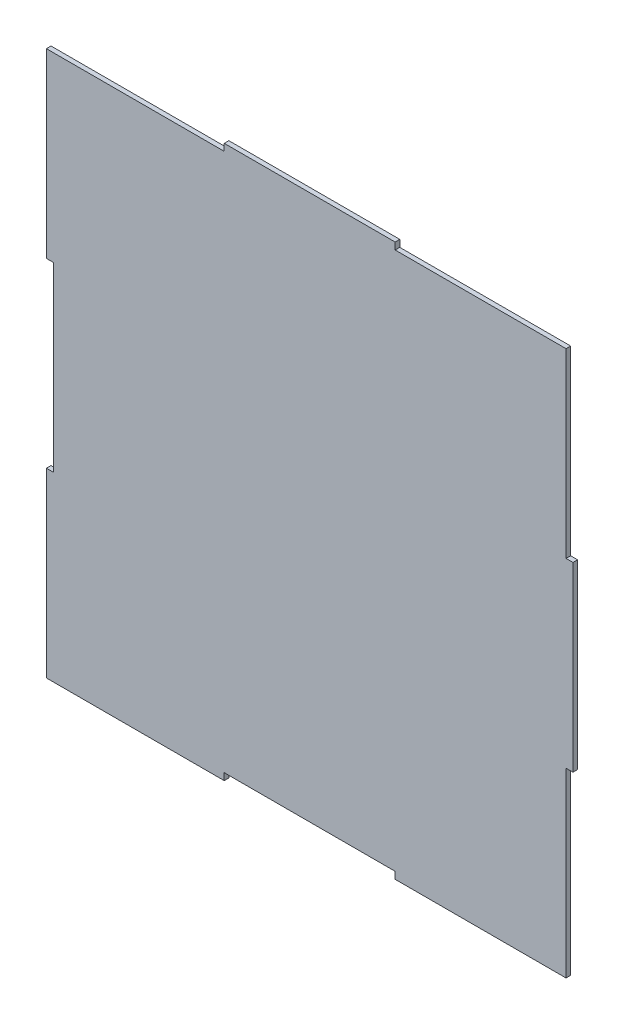
ISO-10303-21;
HEADER;
FILE_DESCRIPTION(('STEP AP214'),'2;1');
FILE_NAME('part.step','',(''),(''),'','','');
FILE_SCHEMA(('AUTOMOTIVE_DESIGN { 1 0 10303 214 1 1 1 1 }'));
ENDSEC;
DATA;
#1=APPLICATION_CONTEXT('core data for automotive mechanical design processes');
#2=APPLICATION_PROTOCOL_DEFINITION('international standard','automotive_design',2000,#1);
#3=PRODUCT_CONTEXT('',#1,'mechanical');
#4=PRODUCT('Part','Part','',(#3));
#5=PRODUCT_RELATED_PRODUCT_CATEGORY('part','',(#4));
#6=PRODUCT_DEFINITION_FORMATION('','',#4);
#7=PRODUCT_DEFINITION_CONTEXT('part definition',#1,'design');
#8=PRODUCT_DEFINITION('design','',#6,#7);
#9=PRODUCT_DEFINITION_SHAPE('','',#8);
#10=(LENGTH_UNIT() NAMED_UNIT(*) SI_UNIT(.MILLI.,.METRE.));
#11=(NAMED_UNIT(*) PLANE_ANGLE_UNIT() SI_UNIT($,.RADIAN.));
#12=(NAMED_UNIT(*) SI_UNIT($,.STERADIAN.) SOLID_ANGLE_UNIT());
#13=UNCERTAINTY_MEASURE_WITH_UNIT(LENGTH_MEASURE(1.E-05),#10,'distance_accuracy_value','');
#14=(GEOMETRIC_REPRESENTATION_CONTEXT(3) GLOBAL_UNCERTAINTY_ASSIGNED_CONTEXT((#13)) GLOBAL_UNIT_ASSIGNED_CONTEXT((#10,
#11,#12)) REPRESENTATION_CONTEXT('',''));
#15=CARTESIAN_POINT('',(0.,0.,0.));
#16=DIRECTION('',(0.,0.,1.));
#17=DIRECTION('',(1.,0.,0.));
#18=AXIS2_PLACEMENT_3D('',#15,#16,#17);
#19=CARTESIAN_POINT('',(-37.,-118.,2.));
#20=DIRECTION('',(-1.,0.,0.));
#21=DIRECTION('',(0.,0.,1.));
#22=AXIS2_PLACEMENT_3D('',#19,#20,#21);
#23=PLANE('',#22);
#24=DIRECTION('',(0.,1.,0.));
#25=VECTOR('',#24,1.);
#26=CARTESIAN_POINT('',(-37.,-118.,0.));
#27=LINE('',#26,#25);
#28=CARTESIAN_POINT('',(-37.,-118.,0.));
#29=VERTEX_POINT('',#28);
#30=CARTESIAN_POINT('',(-37.,-115.,0.));
#31=VERTEX_POINT('',#30);
#32=EDGE_CURVE('E201',#29,#31,#27,.T.);
#33=ORIENTED_EDGE('',*,*,#32,.T.);
#34=DIRECTION('',(0.,0.,-1.));
#35=VECTOR('',#34,1.);
#36=CARTESIAN_POINT('',(-37.,-115.,2.));
#37=LINE('',#36,#35);
#38=CARTESIAN_POINT('',(-37.,-115.,2.));
#39=VERTEX_POINT('',#38);
#40=EDGE_CURVE('E11',#39,#31,#37,.T.);
#41=ORIENTED_EDGE('',*,*,#40,.F.);
#42=DIRECTION('',(0.,1.,0.));
#43=VECTOR('',#42,1.);
#44=CARTESIAN_POINT('',(-37.,-118.,2.));
#45=LINE('',#44,#43);
#46=CARTESIAN_POINT('',(-37.,-118.,2.));
#47=VERTEX_POINT('',#46);
#48=EDGE_CURVE('E241',#47,#39,#45,.T.);
#49=ORIENTED_EDGE('',*,*,#48,.F.);
#50=DIRECTION('',(0.,0.,-1.));
#51=VECTOR('',#50,1.);
#52=CARTESIAN_POINT('',(-37.,-118.,2.));
#53=LINE('',#52,#51);
#54=EDGE_CURVE('E197',#47,#29,#53,.T.);
#55=ORIENTED_EDGE('',*,*,#54,.T.);
#56=EDGE_LOOP('',(#33,#41,#49,#55));
#57=FACE_BOUND('',#56,.T.);
#58=ADVANCED_FACE('F32',(#57),#23,.F.);
#59=CARTESIAN_POINT('',(-37.,-115.,2.));
#60=DIRECTION('',(0.,1.,0.));
#61=DIRECTION('',(0.,0.,1.));
#62=AXIS2_PLACEMENT_3D('',#59,#60,#61);
#63=PLANE('',#62);
#64=DIRECTION('',(1.,0.,0.));
#65=VECTOR('',#64,1.);
#66=CARTESIAN_POINT('',(-37.,-115.,0.));
#67=LINE('',#66,#65);
#68=CARTESIAN_POINT('',(37.,-115.,0.));
#69=VERTEX_POINT('',#68);
#70=EDGE_CURVE('E204',#31,#69,#67,.T.);
#71=ORIENTED_EDGE('',*,*,#70,.T.);
#72=DIRECTION('',(0.,0.,-1.));
#73=VECTOR('',#72,1.);
#74=CARTESIAN_POINT('',(37.,-115.,2.));
#75=LINE('',#74,#73);
#76=CARTESIAN_POINT('',(37.,-115.,2.));
#77=VERTEX_POINT('',#76);
#78=EDGE_CURVE('E40',#77,#69,#75,.T.);
#79=ORIENTED_EDGE('',*,*,#78,.F.);
#80=DIRECTION('',(1.,0.,0.));
#81=VECTOR('',#80,1.);
#82=CARTESIAN_POINT('',(-37.,-115.,2.));
#83=LINE('',#82,#81);
#84=EDGE_CURVE('E125',#39,#77,#83,.T.);
#85=ORIENTED_EDGE('',*,*,#84,.F.);
#86=ORIENTED_EDGE('',*,*,#40,.T.);
#87=EDGE_LOOP('',(#71,#79,#85,#86));
#88=FACE_BOUND('',#87,.T.);
#89=ADVANCED_FACE('F349',(#88),#63,.F.);
#90=CARTESIAN_POINT('',(37.,-118.,2.));
#91=DIRECTION('',(1.,0.,0.));
#92=DIRECTION('',(0.,1.,0.));
#93=AXIS2_PLACEMENT_3D('',#90,#91,#92);
#94=PLANE('',#93);
#95=DIRECTION('',(0.,-1.,0.));
#96=VECTOR('',#95,1.);
#97=CARTESIAN_POINT('',(37.,-118.,0.));
#98=LINE('',#97,#96);
#99=CARTESIAN_POINT('',(37.,-118.,0.));
#100=VERTEX_POINT('',#99);
#101=EDGE_CURVE('E206',#69,#100,#98,.T.);
#102=ORIENTED_EDGE('',*,*,#101,.T.);
#103=DIRECTION('',(0.,0.,-1.));
#104=VECTOR('',#103,1.);
#105=CARTESIAN_POINT('',(37.,-118.,2.));
#106=LINE('',#105,#104);
#107=CARTESIAN_POINT('',(37.,-118.,2.));
#108=VERTEX_POINT('',#107);
#109=EDGE_CURVE('E284',#108,#100,#106,.T.);
#110=ORIENTED_EDGE('',*,*,#109,.F.);
#111=DIRECTION('',(0.,-1.,0.));
#112=VECTOR('',#111,1.);
#113=CARTESIAN_POINT('',(37.,-118.,2.));
#114=LINE('',#113,#112);
#115=EDGE_CURVE('E292',#77,#108,#114,.T.);
#116=ORIENTED_EDGE('',*,*,#115,.F.);
#117=ORIENTED_EDGE('',*,*,#78,.T.);
#118=EDGE_LOOP('',(#102,#110,#116,#117));
#119=FACE_BOUND('',#118,.T.);
#120=ADVANCED_FACE('F290',(#119),#94,.F.);
#121=CARTESIAN_POINT('',(37.,-118.,2.));
#122=DIRECTION('',(0.,1.,0.));
#123=DIRECTION('',(0.,0.,1.));
#124=AXIS2_PLACEMENT_3D('',#121,#122,#123);
#125=PLANE('',#124);
#126=DIRECTION('',(1.,0.,0.));
#127=VECTOR('',#126,1.);
#128=CARTESIAN_POINT('',(37.,-118.,0.));
#129=LINE('',#128,#127);
#130=CARTESIAN_POINT('',(111.,-118.,0.));
#131=VERTEX_POINT('',#130);
#132=EDGE_CURVE('E208',#100,#131,#129,.T.);
#133=ORIENTED_EDGE('',*,*,#132,.T.);
#134=DIRECTION('',(0.,0.,-1.));
#135=VECTOR('',#134,1.);
#136=CARTESIAN_POINT('',(111.,-118.,2.));
#137=LINE('',#136,#135);
#138=CARTESIAN_POINT('',(111.,-118.,2.));
#139=VERTEX_POINT('',#138);
#140=EDGE_CURVE('E281',#139,#131,#137,.T.);
#141=ORIENTED_EDGE('',*,*,#140,.F.);
#142=DIRECTION('',(1.,0.,0.));
#143=VECTOR('',#142,1.);
#144=CARTESIAN_POINT('',(37.,-118.,2.));
#145=LINE('',#144,#143);
#146=EDGE_CURVE('E308',#108,#139,#145,.T.);
#147=ORIENTED_EDGE('',*,*,#146,.F.);
#148=ORIENTED_EDGE('',*,*,#109,.T.);
#149=EDGE_LOOP('',(#133,#141,#147,#148));
#150=FACE_BOUND('',#149,.T.);
#151=ADVANCED_FACE('F299',(#150),#125,.F.);
#152=CARTESIAN_POINT('',(111.,-118.,2.));
#153=DIRECTION('',(-1.,0.,0.));
#154=DIRECTION('',(0.,0.,1.));
#155=AXIS2_PLACEMENT_3D('',#152,#153,#154);
#156=PLANE('',#155);
#157=DIRECTION('',(0.,1.,0.));
#158=VECTOR('',#157,1.);
#159=CARTESIAN_POINT('',(111.,-118.,0.));
#160=LINE('',#159,#158);
#161=CARTESIAN_POINT('',(111.,-39.3333333333333,0.));
#162=VERTEX_POINT('',#161);
#163=EDGE_CURVE('E210',#131,#162,#160,.T.);
#164=ORIENTED_EDGE('',*,*,#163,.T.);
#165=DIRECTION('',(0.,0.,-1.));
#166=VECTOR('',#165,1.);
#167=CARTESIAN_POINT('',(111.,-39.3333333333333,2.));
#168=LINE('',#167,#166);
#169=CARTESIAN_POINT('',(111.,-39.3333333333333,2.));
#170=VERTEX_POINT('',#169);
#171=EDGE_CURVE('E278',#170,#162,#168,.T.);
#172=ORIENTED_EDGE('',*,*,#171,.F.);
#173=DIRECTION('',(0.,1.,0.));
#174=VECTOR('',#173,1.);
#175=CARTESIAN_POINT('',(111.,-118.,2.));
#176=LINE('',#175,#174);
#177=EDGE_CURVE('E305',#139,#170,#176,.T.);
#178=ORIENTED_EDGE('',*,*,#177,.F.);
#179=ORIENTED_EDGE('',*,*,#140,.T.);
#180=EDGE_LOOP('',(#164,#172,#178,#179));
#181=FACE_BOUND('',#180,.T.);
#182=ADVANCED_FACE('F303',(#181),#156,.F.);
#183=CARTESIAN_POINT('',(111.,-39.3333333333333,2.));
#184=DIRECTION('',(0.,1.,0.));
#185=DIRECTION('',(0.,0.,1.));
#186=AXIS2_PLACEMENT_3D('',#183,#184,#185);
#187=PLANE('',#186);
#188=DIRECTION('',(1.,0.,0.));
#189=VECTOR('',#188,1.);
#190=CARTESIAN_POINT('',(111.,-39.3333333333333,0.));
#191=LINE('',#190,#189);
#192=CARTESIAN_POINT('',(114.,-39.3333333333333,0.));
#193=VERTEX_POINT('',#192);
#194=EDGE_CURVE('E212',#162,#193,#191,.T.);
#195=ORIENTED_EDGE('',*,*,#194,.T.);
#196=DIRECTION('',(0.,0.,-1.));
#197=VECTOR('',#196,1.);
#198=CARTESIAN_POINT('',(114.,-39.3333333333333,2.));
#199=LINE('',#198,#197);
#200=CARTESIAN_POINT('',(114.,-39.3333333333333,2.));
#201=VERTEX_POINT('',#200);
#202=EDGE_CURVE('E275',#201,#193,#199,.T.);
#203=ORIENTED_EDGE('',*,*,#202,.F.);
#204=DIRECTION('',(1.,0.,0.));
#205=VECTOR('',#204,1.);
#206=CARTESIAN_POINT('',(111.,-39.3333333333333,2.));
#207=LINE('',#206,#205);
#208=EDGE_CURVE('E307',#170,#201,#207,.T.);
#209=ORIENTED_EDGE('',*,*,#208,.F.);
#210=ORIENTED_EDGE('',*,*,#171,.T.);
#211=EDGE_LOOP('',(#195,#203,#209,#210));
#212=FACE_BOUND('',#211,.T.);
#213=ADVANCED_FACE('F361',(#212),#187,.F.);
#214=CARTESIAN_POINT('',(114.,-39.3333333333333,2.));
#215=DIRECTION('',(-1.,0.,0.));
#216=DIRECTION('',(0.,0.,1.));
#217=AXIS2_PLACEMENT_3D('',#214,#215,#216);
#218=PLANE('',#217);
#219=DIRECTION('',(0.,1.,0.));
#220=VECTOR('',#219,1.);
#221=CARTESIAN_POINT('',(114.,-39.3333333333333,0.));
#222=LINE('',#221,#220);
#223=CARTESIAN_POINT('',(114.,39.3333333333333,0.));
#224=VERTEX_POINT('',#223);
#225=EDGE_CURVE('E214',#193,#224,#222,.T.);
#226=ORIENTED_EDGE('',*,*,#225,.T.);
#227=DIRECTION('',(0.,0.,-1.));
#228=VECTOR('',#227,1.);
#229=CARTESIAN_POINT('',(114.,39.3333333333333,2.));
#230=LINE('',#229,#228);
#231=CARTESIAN_POINT('',(114.,39.3333333333333,2.));
#232=VERTEX_POINT('',#231);
#233=EDGE_CURVE('E272',#232,#224,#230,.T.);
#234=ORIENTED_EDGE('',*,*,#233,.F.);
#235=DIRECTION('',(0.,1.,0.));
#236=VECTOR('',#235,1.);
#237=CARTESIAN_POINT('',(114.,-39.3333333333333,2.));
#238=LINE('',#237,#236);
#239=EDGE_CURVE('E310',#201,#232,#238,.T.);
#240=ORIENTED_EDGE('',*,*,#239,.F.);
#241=ORIENTED_EDGE('',*,*,#202,.T.);
#242=EDGE_LOOP('',(#226,#234,#240,#241));
#243=FACE_BOUND('',#242,.T.);
#244=ADVANCED_FACE('F364',(#243),#218,.F.);
#245=CARTESIAN_POINT('',(111.,39.3333333333333,2.));
#246=DIRECTION('',(0.,-1.,0.));
#247=DIRECTION('',(0.,0.,-1.));
#248=AXIS2_PLACEMENT_3D('',#245,#246,#247);
#249=PLANE('',#248);
#250=DIRECTION('',(-1.,0.,0.));
#251=VECTOR('',#250,1.);
#252=CARTESIAN_POINT('',(111.,39.3333333333333,0.));
#253=LINE('',#252,#251);
#254=CARTESIAN_POINT('',(111.,39.3333333333333,0.));
#255=VERTEX_POINT('',#254);
#256=EDGE_CURVE('E216',#224,#255,#253,.T.);
#257=ORIENTED_EDGE('',*,*,#256,.T.);
#258=DIRECTION('',(0.,0.,-1.));
#259=VECTOR('',#258,1.);
#260=CARTESIAN_POINT('',(111.,39.3333333333333,2.));
#261=LINE('',#260,#259);
#262=CARTESIAN_POINT('',(111.,39.3333333333333,2.));
#263=VERTEX_POINT('',#262);
#264=EDGE_CURVE('E269',#263,#255,#261,.T.);
#265=ORIENTED_EDGE('',*,*,#264,.F.);
#266=DIRECTION('',(-1.,0.,0.));
#267=VECTOR('',#266,1.);
#268=CARTESIAN_POINT('',(111.,39.3333333333333,2.));
#269=LINE('',#268,#267);
#270=EDGE_CURVE('E316',#232,#263,#269,.T.);
#271=ORIENTED_EDGE('',*,*,#270,.F.);
#272=ORIENTED_EDGE('',*,*,#233,.T.);
#273=EDGE_LOOP('',(#257,#265,#271,#272));
#274=FACE_BOUND('',#273,.T.);
#275=ADVANCED_FACE('F368',(#274),#249,.F.);
#276=CARTESIAN_POINT('',(111.,39.3333333333333,2.));
#277=DIRECTION('',(-1.,0.,0.));
#278=DIRECTION('',(0.,0.,1.));
#279=AXIS2_PLACEMENT_3D('',#276,#277,#278);
#280=PLANE('',#279);
#281=DIRECTION('',(0.,1.,0.));
#282=VECTOR('',#281,1.);
#283=CARTESIAN_POINT('',(111.,39.3333333333333,0.));
#284=LINE('',#283,#282);
#285=CARTESIAN_POINT('',(111.,118.,0.));
#286=VERTEX_POINT('',#285);
#287=EDGE_CURVE('E218',#255,#286,#284,.T.);
#288=ORIENTED_EDGE('',*,*,#287,.T.);
#289=DIRECTION('',(0.,0.,-1.));
#290=VECTOR('',#289,1.);
#291=CARTESIAN_POINT('',(111.,118.,2.));
#292=LINE('',#291,#290);
#293=CARTESIAN_POINT('',(111.,118.,2.));
#294=VERTEX_POINT('',#293);
#295=EDGE_CURVE('E266',#294,#286,#292,.T.);
#296=ORIENTED_EDGE('',*,*,#295,.F.);
#297=DIRECTION('',(0.,1.,0.));
#298=VECTOR('',#297,1.);
#299=CARTESIAN_POINT('',(111.,39.3333333333333,2.));
#300=LINE('',#299,#298);
#301=EDGE_CURVE('E318',#263,#294,#300,.T.);
#302=ORIENTED_EDGE('',*,*,#301,.F.);
#303=ORIENTED_EDGE('',*,*,#264,.T.);
#304=EDGE_LOOP('',(#288,#296,#302,#303));
#305=FACE_BOUND('',#304,.T.);
#306=ADVANCED_FACE('F372',(#305),#280,.F.);
#307=CARTESIAN_POINT('',(37.,118.,2.));
#308=DIRECTION('',(0.,-1.,0.));
#309=DIRECTION('',(0.,0.,-1.));
#310=AXIS2_PLACEMENT_3D('',#307,#308,#309);
#311=PLANE('',#310);
#312=DIRECTION('',(-1.,0.,0.));
#313=VECTOR('',#312,1.);
#314=CARTESIAN_POINT('',(37.,118.,0.));
#315=LINE('',#314,#313);
#316=CARTESIAN_POINT('',(37.,118.,0.));
#317=VERTEX_POINT('',#316);
#318=EDGE_CURVE('E220',#286,#317,#315,.T.);
#319=ORIENTED_EDGE('',*,*,#318,.T.);
#320=DIRECTION('',(0.,0.,-1.));
#321=VECTOR('',#320,1.);
#322=CARTESIAN_POINT('',(37.,118.,2.));
#323=LINE('',#322,#321);
#324=CARTESIAN_POINT('',(37.,118.,2.));
#325=VERTEX_POINT('',#324);
#326=EDGE_CURVE('E263',#325,#317,#323,.T.);
#327=ORIENTED_EDGE('',*,*,#326,.F.);
#328=DIRECTION('',(-1.,0.,0.));
#329=VECTOR('',#328,1.);
#330=CARTESIAN_POINT('',(37.,118.,2.));
#331=LINE('',#330,#329);
#332=EDGE_CURVE('E320',#294,#325,#331,.T.);
#333=ORIENTED_EDGE('',*,*,#332,.F.);
#334=ORIENTED_EDGE('',*,*,#295,.T.);
#335=EDGE_LOOP('',(#319,#327,#333,#334));
#336=FACE_BOUND('',#335,.T.);
#337=ADVANCED_FACE('F376',(#336),#311,.F.);
#338=CARTESIAN_POINT('',(37.,118.,2.));
#339=DIRECTION('',(-1.,0.,0.));
#340=DIRECTION('',(0.,0.,1.));
#341=AXIS2_PLACEMENT_3D('',#338,#339,#340);
#342=PLANE('',#341);
#343=DIRECTION('',(0.,1.,0.));
#344=VECTOR('',#343,1.);
#345=CARTESIAN_POINT('',(37.,118.,0.));
#346=LINE('',#345,#344);
#347=CARTESIAN_POINT('',(37.,121.,0.));
#348=VERTEX_POINT('',#347);
#349=EDGE_CURVE('E222',#317,#348,#346,.T.);
#350=ORIENTED_EDGE('',*,*,#349,.T.);
#351=DIRECTION('',(0.,0.,-1.));
#352=VECTOR('',#351,1.);
#353=CARTESIAN_POINT('',(37.,121.,2.));
#354=LINE('',#353,#352);
#355=CARTESIAN_POINT('',(37.,121.,2.));
#356=VERTEX_POINT('',#355);
#357=EDGE_CURVE('E260',#356,#348,#354,.T.);
#358=ORIENTED_EDGE('',*,*,#357,.F.);
#359=DIRECTION('',(0.,1.,0.));
#360=VECTOR('',#359,1.);
#361=CARTESIAN_POINT('',(37.,118.,2.));
#362=LINE('',#361,#360);
#363=EDGE_CURVE('E322',#325,#356,#362,.T.);
#364=ORIENTED_EDGE('',*,*,#363,.F.);
#365=ORIENTED_EDGE('',*,*,#326,.T.);
#366=EDGE_LOOP('',(#350,#358,#364,#365));
#367=FACE_BOUND('',#366,.T.);
#368=ADVANCED_FACE('F380',(#367),#342,.F.);
#369=CARTESIAN_POINT('',(-37.,121.,2.));
#370=DIRECTION('',(0.,-1.,0.));
#371=DIRECTION('',(1.,0.,0.));
#372=AXIS2_PLACEMENT_3D('',#369,#370,#371);
#373=PLANE('',#372);
#374=DIRECTION('',(-1.,0.,0.));
#375=VECTOR('',#374,1.);
#376=CARTESIAN_POINT('',(-37.,121.,0.));
#377=LINE('',#376,#375);
#378=CARTESIAN_POINT('',(-37.,121.,0.));
#379=VERTEX_POINT('',#378);
#380=EDGE_CURVE('E224',#348,#379,#377,.T.);
#381=ORIENTED_EDGE('',*,*,#380,.T.);
#382=DIRECTION('',(0.,0.,-1.));
#383=VECTOR('',#382,1.);
#384=CARTESIAN_POINT('',(-37.,121.,2.));
#385=LINE('',#384,#383);
#386=CARTESIAN_POINT('',(-37.,121.,2.));
#387=VERTEX_POINT('',#386);
#388=EDGE_CURVE('E257',#387,#379,#385,.T.);
#389=ORIENTED_EDGE('',*,*,#388,.F.);
#390=DIRECTION('',(-1.,0.,0.));
#391=VECTOR('',#390,1.);
#392=CARTESIAN_POINT('',(-37.,121.,2.));
#393=LINE('',#392,#391);
#394=EDGE_CURVE('E324',#356,#387,#393,.T.);
#395=ORIENTED_EDGE('',*,*,#394,.F.);
#396=ORIENTED_EDGE('',*,*,#357,.T.);
#397=EDGE_LOOP('',(#381,#389,#395,#396));
#398=FACE_BOUND('',#397,.T.);
#399=ADVANCED_FACE('F384',(#398),#373,.F.);
#400=CARTESIAN_POINT('',(-37.,118.,2.));
#401=DIRECTION('',(1.,0.,0.));
#402=DIRECTION('',(0.,0.,-1.));
#403=AXIS2_PLACEMENT_3D('',#400,#401,#402);
#404=PLANE('',#403);
#405=DIRECTION('',(0.,-1.,0.));
#406=VECTOR('',#405,1.);
#407=CARTESIAN_POINT('',(-37.,118.,0.));
#408=LINE('',#407,#406);
#409=CARTESIAN_POINT('',(-37.,118.,0.));
#410=VERTEX_POINT('',#409);
#411=EDGE_CURVE('E226',#379,#410,#408,.T.);
#412=ORIENTED_EDGE('',*,*,#411,.T.);
#413=DIRECTION('',(0.,0.,-1.));
#414=VECTOR('',#413,1.);
#415=CARTESIAN_POINT('',(-37.,118.,2.));
#416=LINE('',#415,#414);
#417=CARTESIAN_POINT('',(-37.,118.,2.));
#418=VERTEX_POINT('',#417);
#419=EDGE_CURVE('E254',#418,#410,#416,.T.);
#420=ORIENTED_EDGE('',*,*,#419,.F.);
#421=DIRECTION('',(0.,-1.,0.));
#422=VECTOR('',#421,1.);
#423=CARTESIAN_POINT('',(-37.,118.,2.));
#424=LINE('',#423,#422);
#425=EDGE_CURVE('E326',#387,#418,#424,.T.);
#426=ORIENTED_EDGE('',*,*,#425,.F.);
#427=ORIENTED_EDGE('',*,*,#388,.T.);
#428=EDGE_LOOP('',(#412,#420,#426,#427));
#429=FACE_BOUND('',#428,.T.);
#430=ADVANCED_FACE('F388',(#429),#404,.F.);
#431=CARTESIAN_POINT('',(-111.,118.,2.));
#432=DIRECTION('',(0.,-1.,0.));
#433=DIRECTION('',(0.,0.,-1.));
#434=AXIS2_PLACEMENT_3D('',#431,#432,#433);
#435=PLANE('',#434);
#436=DIRECTION('',(-1.,0.,0.));
#437=VECTOR('',#436,1.);
#438=CARTESIAN_POINT('',(-111.,118.,0.));
#439=LINE('',#438,#437);
#440=CARTESIAN_POINT('',(-114.,118.,0.));
#441=VERTEX_POINT('',#440);
#442=EDGE_CURVE('E229',#410,#441,#439,.T.);
#443=ORIENTED_EDGE('',*,*,#442,.T.);
#444=DIRECTION('',(0.,0.,-1.));
#445=VECTOR('',#444,1.);
#446=CARTESIAN_POINT('',(-114.,118.,2.));
#447=LINE('',#446,#445);
#448=CARTESIAN_POINT('',(-114.,118.,2.));
#449=VERTEX_POINT('',#448);
#450=EDGE_CURVE('E251',#449,#441,#447,.T.);
#451=ORIENTED_EDGE('',*,*,#450,.F.);
#452=DIRECTION('',(-1.,0.,0.));
#453=VECTOR('',#452,1.);
#454=CARTESIAN_POINT('',(-111.,118.,2.));
#455=LINE('',#454,#453);
#456=EDGE_CURVE('E328',#418,#449,#455,.T.);
#457=ORIENTED_EDGE('',*,*,#456,.F.);
#458=ORIENTED_EDGE('',*,*,#419,.T.);
#459=EDGE_LOOP('',(#443,#451,#457,#458));
#460=FACE_BOUND('',#459,.T.);
#461=ADVANCED_FACE('F392',(#460),#435,.F.);
#462=CARTESIAN_POINT('',(-114.,118.,2.));
#463=DIRECTION('',(1.,0.,0.));
#464=DIRECTION('',(0.,1.,0.));
#465=AXIS2_PLACEMENT_3D('',#462,#463,#464);
#466=PLANE('',#465);
#467=DIRECTION('',(0.,-1.,0.));
#468=VECTOR('',#467,1.);
#469=CARTESIAN_POINT('',(-114.,118.,0.));
#470=LINE('',#469,#468);
#471=CARTESIAN_POINT('',(-114.,39.3333333333333,0.));
#472=VERTEX_POINT('',#471);
#473=EDGE_CURVE('E231',#441,#472,#470,.T.);
#474=ORIENTED_EDGE('',*,*,#473,.T.);
#475=DIRECTION('',(0.,0.,-1.));
#476=VECTOR('',#475,1.);
#477=CARTESIAN_POINT('',(-114.,39.3333333333333,2.));
#478=LINE('',#477,#476);
#479=CARTESIAN_POINT('',(-114.,39.3333333333333,2.));
#480=VERTEX_POINT('',#479);
#481=EDGE_CURVE('E248',#480,#472,#478,.T.);
#482=ORIENTED_EDGE('',*,*,#481,.F.);
#483=DIRECTION('',(0.,-1.,0.));
#484=VECTOR('',#483,1.);
#485=CARTESIAN_POINT('',(-114.,118.,2.));
#486=LINE('',#485,#484);
#487=EDGE_CURVE('E330',#449,#480,#486,.T.);
#488=ORIENTED_EDGE('',*,*,#487,.F.);
#489=ORIENTED_EDGE('',*,*,#450,.T.);
#490=EDGE_LOOP('',(#474,#482,#488,#489));
#491=FACE_BOUND('',#490,.T.);
#492=ADVANCED_FACE('F396',(#491),#466,.F.);
#493=CARTESIAN_POINT('',(-111.,39.3333333333333,2.));
#494=DIRECTION('',(0.,1.,0.));
#495=DIRECTION('',(0.,0.,1.));
#496=AXIS2_PLACEMENT_3D('',#493,#494,#495);
#497=PLANE('',#496);
#498=DIRECTION('',(1.,0.,0.));
#499=VECTOR('',#498,1.);
#500=CARTESIAN_POINT('',(-111.,39.3333333333333,0.));
#501=LINE('',#500,#499);
#502=CARTESIAN_POINT('',(-111.,39.3333333333333,0.));
#503=VERTEX_POINT('',#502);
#504=EDGE_CURVE('E233',#472,#503,#501,.T.);
#505=ORIENTED_EDGE('',*,*,#504,.T.);
#506=DIRECTION('',(0.,0.,-1.));
#507=VECTOR('',#506,1.);
#508=CARTESIAN_POINT('',(-111.,39.3333333333333,2.));
#509=LINE('',#508,#507);
#510=CARTESIAN_POINT('',(-111.,39.3333333333333,2.));
#511=VERTEX_POINT('',#510);
#512=EDGE_CURVE('E245',#511,#503,#509,.T.);
#513=ORIENTED_EDGE('',*,*,#512,.F.);
#514=DIRECTION('',(1.,0.,0.));
#515=VECTOR('',#514,1.);
#516=CARTESIAN_POINT('',(-111.,39.3333333333333,2.));
#517=LINE('',#516,#515);
#518=EDGE_CURVE('E332',#480,#511,#517,.T.);
#519=ORIENTED_EDGE('',*,*,#518,.F.);
#520=ORIENTED_EDGE('',*,*,#481,.T.);
#521=EDGE_LOOP('',(#505,#513,#519,#520));
#522=FACE_BOUND('',#521,.T.);
#523=ADVANCED_FACE('F338',(#522),#497,.F.);
#524=CARTESIAN_POINT('',(-111.,-39.3333333333333,2.));
#525=DIRECTION('',(1.,0.,0.));
#526=DIRECTION('',(0.,0.,-1.));
#527=AXIS2_PLACEMENT_3D('',#524,#525,#526);
#528=PLANE('',#527);
#529=DIRECTION('',(0.,-1.,0.));
#530=VECTOR('',#529,1.);
#531=CARTESIAN_POINT('',(-111.,-39.3333333333333,0.));
#532=LINE('',#531,#530);
#533=CARTESIAN_POINT('',(-111.,-39.3333333333333,0.));
#534=VERTEX_POINT('',#533);
#535=EDGE_CURVE('E235',#503,#534,#532,.T.);
#536=ORIENTED_EDGE('',*,*,#535,.T.);
#537=DIRECTION('',(0.,0.,-1.));
#538=VECTOR('',#537,1.);
#539=CARTESIAN_POINT('',(-111.,-39.3333333333333,2.));
#540=LINE('',#539,#538);
#541=CARTESIAN_POINT('',(-111.,-39.3333333333333,2.));
#542=VERTEX_POINT('',#541);
#543=EDGE_CURVE('E192',#542,#534,#540,.T.);
#544=ORIENTED_EDGE('',*,*,#543,.F.);
#545=DIRECTION('',(0.,-1.,0.));
#546=VECTOR('',#545,1.);
#547=CARTESIAN_POINT('',(-111.,-39.3333333333333,2.));
#548=LINE('',#547,#546);
#549=EDGE_CURVE('E181',#511,#542,#548,.T.);
#550=ORIENTED_EDGE('',*,*,#549,.F.);
#551=ORIENTED_EDGE('',*,*,#512,.T.);
#552=EDGE_LOOP('',(#536,#544,#550,#551));
#553=FACE_BOUND('',#552,.T.);
#554=ADVANCED_FACE('F342',(#553),#528,.F.);
#555=CARTESIAN_POINT('',(-111.,-39.3333333333333,2.));
#556=DIRECTION('',(0.,-1.,0.));
#557=DIRECTION('',(0.,0.,-1.));
#558=AXIS2_PLACEMENT_3D('',#555,#556,#557);
#559=PLANE('',#558);
#560=DIRECTION('',(-1.,0.,0.));
#561=VECTOR('',#560,1.);
#562=CARTESIAN_POINT('',(-111.,-39.3333333333333,0.));
#563=LINE('',#562,#561);
#564=CARTESIAN_POINT('',(-114.,-39.3333333333333,0.));
#565=VERTEX_POINT('',#564);
#566=EDGE_CURVE('E190',#534,#565,#563,.T.);
#567=ORIENTED_EDGE('',*,*,#566,.T.);
#568=DIRECTION('',(0.,0.,-1.));
#569=VECTOR('',#568,1.);
#570=CARTESIAN_POINT('',(-114.,-39.3333333333333,2.));
#571=LINE('',#570,#569);
#572=CARTESIAN_POINT('',(-114.,-39.3333333333333,2.));
#573=VERTEX_POINT('',#572);
#574=EDGE_CURVE('E187',#573,#565,#571,.T.);
#575=ORIENTED_EDGE('',*,*,#574,.F.);
#576=DIRECTION('',(-1.,0.,0.));
#577=VECTOR('',#576,1.);
#578=CARTESIAN_POINT('',(-111.,-39.3333333333333,2.));
#579=LINE('',#578,#577);
#580=EDGE_CURVE('E174',#542,#573,#579,.T.);
#581=ORIENTED_EDGE('',*,*,#580,.F.);
#582=ORIENTED_EDGE('',*,*,#543,.T.);
#583=EDGE_LOOP('',(#567,#575,#581,#582));
#584=FACE_BOUND('',#583,.T.);
#585=ADVANCED_FACE('F188',(#584),#559,.F.);
#586=CARTESIAN_POINT('',(-114.,-118.,2.));
#587=DIRECTION('',(1.,0.,0.));
#588=DIRECTION('',(0.,0.,-1.));
#589=AXIS2_PLACEMENT_3D('',#586,#587,#588);
#590=PLANE('',#589);
#591=DIRECTION('',(0.,-1.,0.));
#592=VECTOR('',#591,1.);
#593=CARTESIAN_POINT('',(-114.,-118.,0.));
#594=LINE('',#593,#592);
#595=CARTESIAN_POINT('',(-114.,-118.,0.));
#596=VERTEX_POINT('',#595);
#597=EDGE_CURVE('E238',#565,#596,#594,.T.);
#598=ORIENTED_EDGE('',*,*,#597,.T.);
#599=DIRECTION('',(0.,0.,-1.));
#600=VECTOR('',#599,1.);
#601=CARTESIAN_POINT('',(-114.,-118.,2.));
#602=LINE('',#601,#600);
#603=CARTESIAN_POINT('',(-114.,-118.,2.));
#604=VERTEX_POINT('',#603);
#605=EDGE_CURVE('E193',#604,#596,#602,.T.);
#606=ORIENTED_EDGE('',*,*,#605,.F.);
#607=DIRECTION('',(0.,-1.,0.));
#608=VECTOR('',#607,1.);
#609=CARTESIAN_POINT('',(-114.,-118.,2.));
#610=LINE('',#609,#608);
#611=EDGE_CURVE('E178',#573,#604,#610,.T.);
#612=ORIENTED_EDGE('',*,*,#611,.F.);
#613=ORIENTED_EDGE('',*,*,#574,.T.);
#614=EDGE_LOOP('',(#598,#606,#612,#613));
#615=FACE_BOUND('',#614,.T.);
#616=ADVANCED_FACE('F195',(#615),#590,.F.);
#617=CARTESIAN_POINT('',(-111.,-118.,2.));
#618=DIRECTION('',(0.,1.,0.));
#619=DIRECTION('',(0.,0.,1.));
#620=AXIS2_PLACEMENT_3D('',#617,#618,#619);
#621=PLANE('',#620);
#622=DIRECTION('',(1.,0.,0.));
#623=VECTOR('',#622,1.);
#624=CARTESIAN_POINT('',(-111.,-118.,0.));
#625=LINE('',#624,#623);
#626=EDGE_CURVE('E113',#596,#29,#625,.T.);
#627=ORIENTED_EDGE('',*,*,#626,.T.);
#628=ORIENTED_EDGE('',*,*,#54,.F.);
#629=DIRECTION('',(1.,0.,0.));
#630=VECTOR('',#629,1.);
#631=CARTESIAN_POINT('',(-111.,-118.,2.));
#632=LINE('',#631,#630);
#633=EDGE_CURVE('E48',#604,#47,#632,.T.);
#634=ORIENTED_EDGE('',*,*,#633,.F.);
#635=ORIENTED_EDGE('',*,*,#605,.T.);
#636=EDGE_LOOP('',(#627,#628,#634,#635));
#637=FACE_BOUND('',#636,.T.);
#638=ADVANCED_FACE('F343',(#637),#621,.F.);
#639=CARTESIAN_POINT('',(0.,0.,2.));
#640=DIRECTION('',(0.,0.,-1.));
#641=DIRECTION('',(-1.,0.,0.));
#642=AXIS2_PLACEMENT_3D('',#639,#640,#641);
#643=PLANE('',#642);
#644=ORIENTED_EDGE('',*,*,#48,.T.);
#645=ORIENTED_EDGE('',*,*,#84,.T.);
#646=ORIENTED_EDGE('',*,*,#115,.T.);
#647=ORIENTED_EDGE('',*,*,#146,.T.);
#648=ORIENTED_EDGE('',*,*,#177,.T.);
#649=ORIENTED_EDGE('',*,*,#208,.T.);
#650=ORIENTED_EDGE('',*,*,#239,.T.);
#651=ORIENTED_EDGE('',*,*,#270,.T.);
#652=ORIENTED_EDGE('',*,*,#301,.T.);
#653=ORIENTED_EDGE('',*,*,#332,.T.);
#654=ORIENTED_EDGE('',*,*,#363,.T.);
#655=ORIENTED_EDGE('',*,*,#394,.T.);
#656=ORIENTED_EDGE('',*,*,#425,.T.);
#657=ORIENTED_EDGE('',*,*,#456,.T.);
#658=ORIENTED_EDGE('',*,*,#487,.T.);
#659=ORIENTED_EDGE('',*,*,#518,.T.);
#660=ORIENTED_EDGE('',*,*,#549,.T.);
#661=ORIENTED_EDGE('',*,*,#580,.T.);
#662=ORIENTED_EDGE('',*,*,#611,.T.);
#663=ORIENTED_EDGE('',*,*,#633,.T.);
#664=EDGE_LOOP('',(#644,#645,#646,#647,#648,#649,#650,#651,#652,#653,#654,#655,#656,#657,#658,
#659,#660,#661,#662,#663));
#665=FACE_BOUND('',#664,.T.);
#666=ADVANCED_FACE('F176',(#665),#643,.F.);
#667=CARTESIAN_POINT('',(0.,0.,0.));
#668=DIRECTION('',(0.,0.,-1.));
#669=DIRECTION('',(-1.,0.,0.));
#670=AXIS2_PLACEMENT_3D('',#667,#668,#669);
#671=PLANE('',#670);
#672=ORIENTED_EDGE('',*,*,#32,.F.);
#673=ORIENTED_EDGE('',*,*,#626,.F.);
#674=ORIENTED_EDGE('',*,*,#597,.F.);
#675=ORIENTED_EDGE('',*,*,#566,.F.);
#676=ORIENTED_EDGE('',*,*,#535,.F.);
#677=ORIENTED_EDGE('',*,*,#504,.F.);
#678=ORIENTED_EDGE('',*,*,#473,.F.);
#679=ORIENTED_EDGE('',*,*,#442,.F.);
#680=ORIENTED_EDGE('',*,*,#411,.F.);
#681=ORIENTED_EDGE('',*,*,#380,.F.);
#682=ORIENTED_EDGE('',*,*,#349,.F.);
#683=ORIENTED_EDGE('',*,*,#318,.F.);
#684=ORIENTED_EDGE('',*,*,#287,.F.);
#685=ORIENTED_EDGE('',*,*,#256,.F.);
#686=ORIENTED_EDGE('',*,*,#225,.F.);
#687=ORIENTED_EDGE('',*,*,#194,.F.);
#688=ORIENTED_EDGE('',*,*,#163,.F.);
#689=ORIENTED_EDGE('',*,*,#132,.F.);
#690=ORIENTED_EDGE('',*,*,#101,.F.);
#691=ORIENTED_EDGE('',*,*,#70,.F.);
#692=EDGE_LOOP('',(#672,#673,#674,#675,#676,#677,#678,#679,#680,#681,#682,#683,#684,#685,#686,
#687,#688,#689,#690,#691));
#693=FACE_BOUND('',#692,.T.);
#694=ADVANCED_FACE('F294',(#693),#671,.T.);
#695=CLOSED_SHELL('',(#58,#89,#120,#151,#182,#213,#244,#275,#306,#337,#368,#399,#430,#461,#492,
#523,#554,#585,#616,#638,#666,#694));
#696=MANIFOLD_SOLID_BREP('B2',#695);
#697=ADVANCED_BREP_SHAPE_REPRESENTATION('',(#18,#696),#14);
#698=SHAPE_DEFINITION_REPRESENTATION(#9,#697);
ENDSEC;
END-ISO-10303-21;
